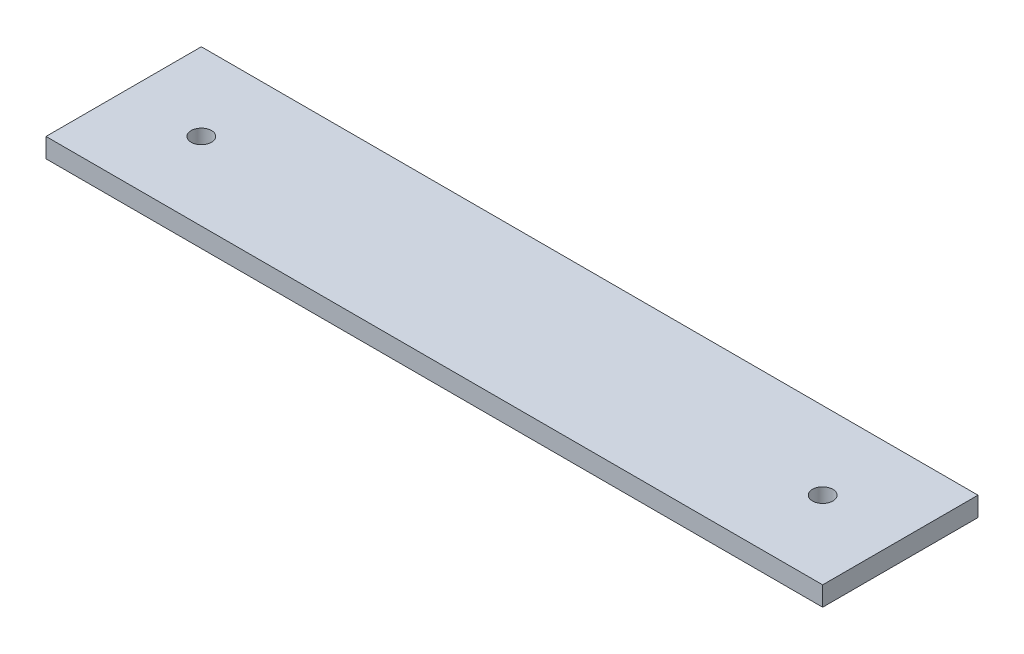
ISO-10303-21;
HEADER;
FILE_DESCRIPTION(('STEP AP214'),'2;1');
FILE_NAME('part.step','',(''),(''),'','','');
FILE_SCHEMA(('AUTOMOTIVE_DESIGN { 1 0 10303 214 1 1 1 1 }'));
ENDSEC;
DATA;
#1=APPLICATION_CONTEXT('core data for automotive mechanical design processes');
#2=APPLICATION_PROTOCOL_DEFINITION('international standard','automotive_design',2000,#1);
#3=PRODUCT_CONTEXT('',#1,'mechanical');
#4=PRODUCT('Part','Part','',(#3));
#5=PRODUCT_RELATED_PRODUCT_CATEGORY('part','',(#4));
#6=PRODUCT_DEFINITION_FORMATION('','',#4);
#7=PRODUCT_DEFINITION_CONTEXT('part definition',#1,'design');
#8=PRODUCT_DEFINITION('design','',#6,#7);
#9=PRODUCT_DEFINITION_SHAPE('','',#8);
#10=(LENGTH_UNIT() NAMED_UNIT(*) SI_UNIT(.MILLI.,.METRE.));
#11=(NAMED_UNIT(*) PLANE_ANGLE_UNIT() SI_UNIT($,.RADIAN.));
#12=(NAMED_UNIT(*) SI_UNIT($,.STERADIAN.) SOLID_ANGLE_UNIT());
#13=UNCERTAINTY_MEASURE_WITH_UNIT(LENGTH_MEASURE(1.E-05),#10,'distance_accuracy_value','');
#14=(GEOMETRIC_REPRESENTATION_CONTEXT(3) GLOBAL_UNCERTAINTY_ASSIGNED_CONTEXT((#13)) GLOBAL_UNIT_ASSIGNED_CONTEXT((#10,
#11,#12)) REPRESENTATION_CONTEXT('',''));
#15=CARTESIAN_POINT('',(0.,0.,0.));
#16=DIRECTION('',(0.,0.,1.));
#17=DIRECTION('',(1.,0.,0.));
#18=AXIS2_PLACEMENT_3D('',#15,#16,#17);
#19=CARTESIAN_POINT('',(4.,0.,61.));
#20=DIRECTION('',(0.,0.,1.));
#21=DIRECTION('',(1.,0.,0.));
#22=AXIS2_PLACEMENT_3D('',#19,#20,#21);
#23=PLANE('',#22);
#24=DIRECTION('',(-1.,0.,0.));
#25=VECTOR('',#24,1.);
#26=CARTESIAN_POINT('',(4.,-2.,61.));
#27=LINE('',#26,#25);
#28=CARTESIAN_POINT('',(84.,-2.,61.));
#29=VERTEX_POINT('',#28);
#30=CARTESIAN_POINT('',(-76.,-2.,61.));
#31=VERTEX_POINT('',#30);
#32=EDGE_CURVE('E9',#29,#31,#27,.T.);
#33=ORIENTED_EDGE('',*,*,#32,.F.);
#34=DIRECTION('',(0.,-1.,0.));
#35=VECTOR('',#34,1.);
#36=CARTESIAN_POINT('',(84.,0.,61.));
#37=LINE('',#36,#35);
#38=CARTESIAN_POINT('',(84.,2.,61.));
#39=VERTEX_POINT('',#38);
#40=EDGE_CURVE('E62',#39,#29,#37,.T.);
#41=ORIENTED_EDGE('',*,*,#40,.F.);
#42=DIRECTION('',(1.,0.,0.));
#43=VECTOR('',#42,1.);
#44=CARTESIAN_POINT('',(4.,2.,61.));
#45=LINE('',#44,#43);
#46=CARTESIAN_POINT('',(-76.,2.,61.));
#47=VERTEX_POINT('',#46);
#48=EDGE_CURVE('E101',#47,#39,#45,.T.);
#49=ORIENTED_EDGE('',*,*,#48,.F.);
#50=DIRECTION('',(0.,1.,0.));
#51=VECTOR('',#50,1.);
#52=CARTESIAN_POINT('',(-76.,0.,61.));
#53=LINE('',#52,#51);
#54=EDGE_CURVE('E24',#31,#47,#53,.T.);
#55=ORIENTED_EDGE('',*,*,#54,.F.);
#56=EDGE_LOOP('',(#33,#41,#49,#55));
#57=FACE_BOUND('',#56,.T.);
#58=ADVANCED_FACE('F15',(#57),#23,.T.);
#59=CARTESIAN_POINT('',(4.,-2.,29.));
#60=DIRECTION('',(0.,-1.,0.));
#61=DIRECTION('',(0.,0.,-1.));
#62=AXIS2_PLACEMENT_3D('',#59,#60,#61);
#63=PLANE('',#62);
#64=CARTESIAN_POINT('',(68.,-2.,45.));
#65=DIRECTION('',(0.,-1.,0.));
#66=DIRECTION('',(0.,0.,-1.));
#67=AXIS2_PLACEMENT_3D('',#64,#65,#66);
#68=CIRCLE('',#67,2.1);
#69=CARTESIAN_POINT('',(68.,-2.,42.9));
#70=VERTEX_POINT('',#69);
#71=EDGE_CURVE('E107',#70,#70,#68,.T.);
#72=ORIENTED_EDGE('',*,*,#71,.F.);
#73=EDGE_LOOP('',(#72));
#74=FACE_BOUND('',#73,.T.);
#75=CARTESIAN_POINT('',(-60.,-2.,45.));
#76=DIRECTION('',(0.,-1.,0.));
#77=DIRECTION('',(0.,0.,-1.));
#78=AXIS2_PLACEMENT_3D('',#75,#76,#77);
#79=CIRCLE('',#78,2.1);
#80=CARTESIAN_POINT('',(-60.,-2.,42.9));
#81=VERTEX_POINT('',#80);
#82=EDGE_CURVE('E75',#81,#81,#79,.T.);
#83=ORIENTED_EDGE('',*,*,#82,.F.);
#84=EDGE_LOOP('',(#83));
#85=FACE_BOUND('',#84,.T.);
#86=DIRECTION('',(0.,0.,1.));
#87=VECTOR('',#86,1.);
#88=CARTESIAN_POINT('',(84.,-2.,29.));
#89=LINE('',#88,#87);
#90=CARTESIAN_POINT('',(84.,-2.,29.));
#91=VERTEX_POINT('',#90);
#92=EDGE_CURVE('E55',#91,#29,#89,.T.);
#93=ORIENTED_EDGE('',*,*,#92,.T.);
#94=ORIENTED_EDGE('',*,*,#32,.T.);
#95=DIRECTION('',(0.,0.,1.));
#96=VECTOR('',#95,1.);
#97=CARTESIAN_POINT('',(-76.,-2.,29.));
#98=LINE('',#97,#96);
#99=CARTESIAN_POINT('',(-76.,-2.,29.));
#100=VERTEX_POINT('',#99);
#101=EDGE_CURVE('E69',#100,#31,#98,.T.);
#102=ORIENTED_EDGE('',*,*,#101,.F.);
#103=DIRECTION('',(1.,0.,0.));
#104=VECTOR('',#103,1.);
#105=CARTESIAN_POINT('',(4.,-2.,29.));
#106=LINE('',#105,#104);
#107=EDGE_CURVE('E67',#100,#91,#106,.T.);
#108=ORIENTED_EDGE('',*,*,#107,.T.);
#109=EDGE_LOOP('',(#93,#94,#102,#108));
#110=FACE_BOUND('',#109,.T.);
#111=ADVANCED_FACE('F68',(#74,#85,#110),#63,.T.);
#112=CARTESIAN_POINT('',(-76.,0.,29.));
#113=DIRECTION('',(-1.,0.,0.));
#114=DIRECTION('',(0.,0.,1.));
#115=AXIS2_PLACEMENT_3D('',#112,#113,#114);
#116=PLANE('',#115);
#117=ORIENTED_EDGE('',*,*,#101,.T.);
#118=ORIENTED_EDGE('',*,*,#54,.T.);
#119=DIRECTION('',(0.,0.,1.));
#120=VECTOR('',#119,1.);
#121=CARTESIAN_POINT('',(-76.,2.,29.));
#122=LINE('',#121,#120);
#123=CARTESIAN_POINT('',(-76.,2.,29.));
#124=VERTEX_POINT('',#123);
#125=EDGE_CURVE('E94',#124,#47,#122,.T.);
#126=ORIENTED_EDGE('',*,*,#125,.F.);
#127=DIRECTION('',(0.,-1.,0.));
#128=VECTOR('',#127,1.);
#129=CARTESIAN_POINT('',(-76.,0.,29.));
#130=LINE('',#129,#128);
#131=EDGE_CURVE('E74',#124,#100,#130,.T.);
#132=ORIENTED_EDGE('',*,*,#131,.T.);
#133=EDGE_LOOP('',(#117,#118,#126,#132));
#134=FACE_BOUND('',#133,.T.);
#135=ADVANCED_FACE('F126',(#134),#116,.T.);
#136=CARTESIAN_POINT('',(4.,2.,29.));
#137=DIRECTION('',(0.,1.,0.));
#138=DIRECTION('',(0.,0.,1.));
#139=AXIS2_PLACEMENT_3D('',#136,#137,#138);
#140=PLANE('',#139);
#141=CARTESIAN_POINT('',(68.,2.,45.));
#142=DIRECTION('',(0.,1.,0.));
#143=DIRECTION('',(0.,0.,1.));
#144=AXIS2_PLACEMENT_3D('',#141,#142,#143);
#145=CIRCLE('',#144,2.1);
#146=CARTESIAN_POINT('',(68.,2.,47.1));
#147=VERTEX_POINT('',#146);
#148=EDGE_CURVE('E18',#147,#147,#145,.T.);
#149=ORIENTED_EDGE('',*,*,#148,.F.);
#150=EDGE_LOOP('',(#149));
#151=FACE_BOUND('',#150,.T.);
#152=CARTESIAN_POINT('',(-60.,2.,45.));
#153=DIRECTION('',(0.,1.,0.));
#154=DIRECTION('',(0.,0.,1.));
#155=AXIS2_PLACEMENT_3D('',#152,#153,#154);
#156=CIRCLE('',#155,2.1);
#157=CARTESIAN_POINT('',(-60.,2.,47.1));
#158=VERTEX_POINT('',#157);
#159=EDGE_CURVE('E104',#158,#158,#156,.T.);
#160=ORIENTED_EDGE('',*,*,#159,.F.);
#161=EDGE_LOOP('',(#160));
#162=FACE_BOUND('',#161,.T.);
#163=ORIENTED_EDGE('',*,*,#125,.T.);
#164=ORIENTED_EDGE('',*,*,#48,.T.);
#165=DIRECTION('',(0.,0.,1.));
#166=VECTOR('',#165,1.);
#167=CARTESIAN_POINT('',(84.,2.,29.));
#168=LINE('',#167,#166);
#169=CARTESIAN_POINT('',(84.,2.,29.));
#170=VERTEX_POINT('',#169);
#171=EDGE_CURVE('E64',#170,#39,#168,.T.);
#172=ORIENTED_EDGE('',*,*,#171,.F.);
#173=DIRECTION('',(-1.,0.,0.));
#174=VECTOR('',#173,1.);
#175=CARTESIAN_POINT('',(4.,2.,29.));
#176=LINE('',#175,#174);
#177=EDGE_CURVE('E80',#170,#124,#176,.T.);
#178=ORIENTED_EDGE('',*,*,#177,.T.);
#179=EDGE_LOOP('',(#163,#164,#172,#178));
#180=FACE_BOUND('',#179,.T.);
#181=ADVANCED_FACE('F123',(#151,#162,#180),#140,.T.);
#182=CARTESIAN_POINT('',(4.,0.,29.));
#183=DIRECTION('',(0.,0.,-1.));
#184=DIRECTION('',(-1.,0.,0.));
#185=AXIS2_PLACEMENT_3D('',#182,#183,#184);
#186=PLANE('',#185);
#187=DIRECTION('',(0.,1.,0.));
#188=VECTOR('',#187,1.);
#189=CARTESIAN_POINT('',(84.,0.,29.));
#190=LINE('',#189,#188);
#191=EDGE_CURVE('E60',#91,#170,#190,.T.);
#192=ORIENTED_EDGE('',*,*,#191,.F.);
#193=ORIENTED_EDGE('',*,*,#107,.F.);
#194=ORIENTED_EDGE('',*,*,#131,.F.);
#195=ORIENTED_EDGE('',*,*,#177,.F.);
#196=EDGE_LOOP('',(#192,#193,#194,#195));
#197=FACE_BOUND('',#196,.T.);
#198=ADVANCED_FACE('F78',(#197),#186,.T.);
#199=CARTESIAN_POINT('',(84.,0.,29.));
#200=DIRECTION('',(1.,0.,0.));
#201=DIRECTION('',(0.,0.,-1.));
#202=AXIS2_PLACEMENT_3D('',#199,#200,#201);
#203=PLANE('',#202);
#204=ORIENTED_EDGE('',*,*,#191,.T.);
#205=ORIENTED_EDGE('',*,*,#171,.T.);
#206=ORIENTED_EDGE('',*,*,#40,.T.);
#207=ORIENTED_EDGE('',*,*,#92,.F.);
#208=EDGE_LOOP('',(#204,#205,#206,#207));
#209=FACE_BOUND('',#208,.T.);
#210=ADVANCED_FACE('F57',(#209),#203,.T.);
#211=CARTESIAN_POINT('',(-60.,-2.4,45.));
#212=DIRECTION('',(0.,1.,0.));
#213=DIRECTION('',(0.,0.,1.));
#214=AXIS2_PLACEMENT_3D('',#211,#212,#213);
#215=CYLINDRICAL_SURFACE('',#214,2.1);
#216=ORIENTED_EDGE('',*,*,#82,.T.);
#217=EDGE_LOOP('',(#216));
#218=FACE_BOUND('',#217,.T.);
#219=ORIENTED_EDGE('',*,*,#159,.T.);
#220=EDGE_LOOP('',(#219));
#221=FACE_BOUND('',#220,.T.);
#222=ADVANCED_FACE('F176',(#218,#221),#215,.F.);
#223=CARTESIAN_POINT('',(68.,-2.4,45.));
#224=DIRECTION('',(0.,1.,0.));
#225=DIRECTION('',(0.,0.,1.));
#226=AXIS2_PLACEMENT_3D('',#223,#224,#225);
#227=CYLINDRICAL_SURFACE('',#226,2.1);
#228=ORIENTED_EDGE('',*,*,#71,.T.);
#229=EDGE_LOOP('',(#228));
#230=FACE_BOUND('',#229,.T.);
#231=ORIENTED_EDGE('',*,*,#148,.T.);
#232=EDGE_LOOP('',(#231));
#233=FACE_BOUND('',#232,.T.);
#234=ADVANCED_FACE('F121',(#230,#233),#227,.F.);
#235=CLOSED_SHELL('',(#58,#111,#135,#181,#198,#210,#222,#234));
#236=MANIFOLD_SOLID_BREP('B1',#235);
#237=ADVANCED_BREP_SHAPE_REPRESENTATION('',(#18,#236),#14);
#238=SHAPE_DEFINITION_REPRESENTATION(#9,#237);
ENDSEC;
END-ISO-10303-21;
